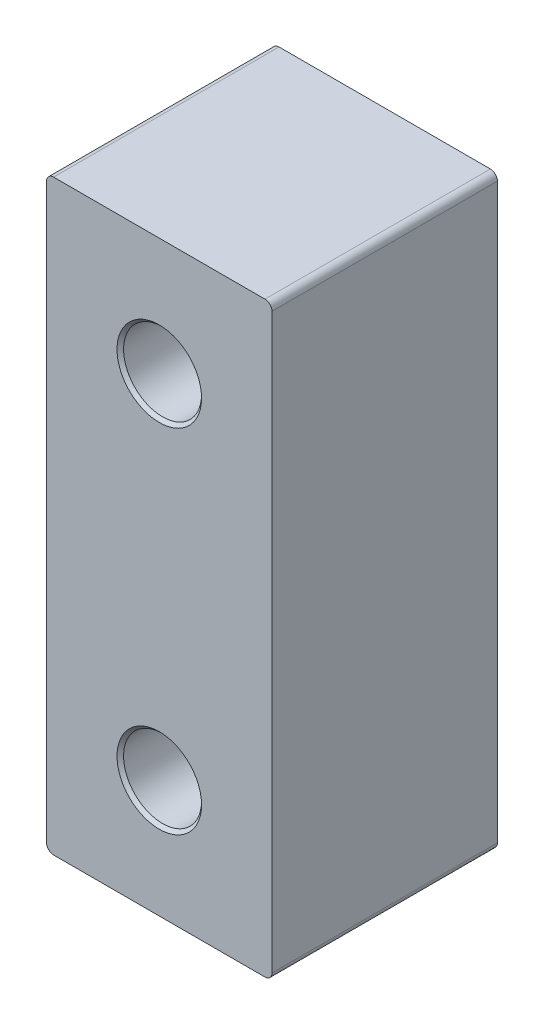
ISO-10303-21;
HEADER;
FILE_DESCRIPTION(('STEP AP214'),'2;1');
FILE_NAME('part.step','',(''),(''),'','','');
FILE_SCHEMA(('AUTOMOTIVE_DESIGN { 1 0 10303 214 1 1 1 1 }'));
ENDSEC;
DATA;
#1=APPLICATION_CONTEXT('core data for automotive mechanical design processes');
#2=APPLICATION_PROTOCOL_DEFINITION('international standard','automotive_design',2000,#1);
#3=PRODUCT_CONTEXT('',#1,'mechanical');
#4=PRODUCT('Part','Part','',(#3));
#5=PRODUCT_RELATED_PRODUCT_CATEGORY('part','',(#4));
#6=PRODUCT_DEFINITION_FORMATION('','',#4);
#7=PRODUCT_DEFINITION_CONTEXT('part definition',#1,'design');
#8=PRODUCT_DEFINITION('design','',#6,#7);
#9=PRODUCT_DEFINITION_SHAPE('','',#8);
#10=(LENGTH_UNIT() NAMED_UNIT(*) SI_UNIT(.MILLI.,.METRE.));
#11=(NAMED_UNIT(*) PLANE_ANGLE_UNIT() SI_UNIT($,.RADIAN.));
#12=(NAMED_UNIT(*) SI_UNIT($,.STERADIAN.) SOLID_ANGLE_UNIT());
#13=UNCERTAINTY_MEASURE_WITH_UNIT(LENGTH_MEASURE(1.E-05),#10,'distance_accuracy_value','');
#14=(GEOMETRIC_REPRESENTATION_CONTEXT(3) GLOBAL_UNCERTAINTY_ASSIGNED_CONTEXT((#13)) GLOBAL_UNIT_ASSIGNED_CONTEXT((#10,
#11,#12)) REPRESENTATION_CONTEXT('',''));
#15=CARTESIAN_POINT('',(0.,0.,0.));
#16=DIRECTION('',(0.,0.,1.));
#17=DIRECTION('',(1.,0.,0.));
#18=AXIS2_PLACEMENT_3D('',#15,#16,#17);
#19=CARTESIAN_POINT('',(-6.096,15.875,12.192));
#20=DIRECTION('',(1.,0.,0.));
#21=DIRECTION('',(0.,0.,-1.));
#22=AXIS2_PLACEMENT_3D('',#19,#20,#21);
#23=PLANE('',#22);
#24=DIRECTION('',(0.,-1.,0.));
#25=VECTOR('',#24,1.);
#26=CARTESIAN_POINT('',(-6.096,15.875,12.192));
#27=LINE('',#26,#25);
#28=CARTESIAN_POINT('',(-6.096,15.494,12.192));
#29=VERTEX_POINT('',#28);
#30=CARTESIAN_POINT('',(-6.096,-15.494,12.192));
#31=VERTEX_POINT('',#30);
#32=EDGE_CURVE('E120',#29,#31,#27,.T.);
#33=ORIENTED_EDGE('',*,*,#32,.F.);
#34=DIRECTION('',(0.,0.,-1.));
#35=VECTOR('',#34,1.);
#36=CARTESIAN_POINT('',(-6.096,15.494,12.192));
#37=LINE('',#36,#35);
#38=CARTESIAN_POINT('',(-6.096,15.494,0.));
#39=VERTEX_POINT('',#38);
#40=EDGE_CURVE('E105',#29,#39,#37,.T.);
#41=ORIENTED_EDGE('',*,*,#40,.T.);
#42=DIRECTION('',(0.,-1.,0.));
#43=VECTOR('',#42,1.);
#44=CARTESIAN_POINT('',(-6.096,15.875,0.));
#45=LINE('',#44,#43);
#46=CARTESIAN_POINT('',(-6.096,-15.494,0.));
#47=VERTEX_POINT('',#46);
#48=EDGE_CURVE('E117',#39,#47,#45,.T.);
#49=ORIENTED_EDGE('',*,*,#48,.T.);
#50=DIRECTION('',(0.,0.,-1.));
#51=VECTOR('',#50,1.);
#52=CARTESIAN_POINT('',(-6.096,-15.494,12.192));
#53=LINE('',#52,#51);
#54=EDGE_CURVE('E122',#47,#31,#53,.F.);
#55=ORIENTED_EDGE('',*,*,#54,.T.);
#56=EDGE_LOOP('',(#33,#41,#49,#55));
#57=FACE_BOUND('',#56,.T.);
#58=ADVANCED_FACE('F36',(#57),#23,.F.);
#59=CARTESIAN_POINT('',(-6.096,-15.875,12.192));
#60=DIRECTION('',(0.,1.,0.));
#61=DIRECTION('',(0.,0.,1.));
#62=AXIS2_PLACEMENT_3D('',#59,#60,#61);
#63=PLANE('',#62);
#64=DIRECTION('',(1.,0.,0.));
#65=VECTOR('',#64,1.);
#66=CARTESIAN_POINT('',(-6.096,-15.875,12.192));
#67=LINE('',#66,#65);
#68=CARTESIAN_POINT('',(-5.715,-15.875,12.192));
#69=VERTEX_POINT('',#68);
#70=CARTESIAN_POINT('',(5.715,-15.875,12.192));
#71=VERTEX_POINT('',#70);
#72=EDGE_CURVE('E178',#69,#71,#67,.T.);
#73=ORIENTED_EDGE('',*,*,#72,.F.);
#74=DIRECTION('',(0.,0.,-1.));
#75=VECTOR('',#74,1.);
#76=CARTESIAN_POINT('',(-5.715,-15.875,12.192));
#77=LINE('',#76,#75);
#78=CARTESIAN_POINT('',(-5.715,-15.875,0.));
#79=VERTEX_POINT('',#78);
#80=EDGE_CURVE('E159',#69,#79,#77,.T.);
#81=ORIENTED_EDGE('',*,*,#80,.T.);
#82=DIRECTION('',(1.,0.,0.));
#83=VECTOR('',#82,1.);
#84=CARTESIAN_POINT('',(-6.096,-15.875,0.));
#85=LINE('',#84,#83);
#86=CARTESIAN_POINT('',(5.715,-15.875,0.));
#87=VERTEX_POINT('',#86);
#88=EDGE_CURVE('E126',#79,#87,#85,.T.);
#89=ORIENTED_EDGE('',*,*,#88,.T.);
#90=DIRECTION('',(0.,0.,-1.));
#91=VECTOR('',#90,1.);
#92=CARTESIAN_POINT('',(5.71500000000001,-15.875,12.192));
#93=LINE('',#92,#91);
#94=EDGE_CURVE('E157',#87,#71,#93,.F.);
#95=ORIENTED_EDGE('',*,*,#94,.T.);
#96=EDGE_LOOP('',(#73,#81,#89,#95));
#97=FACE_BOUND('',#96,.T.);
#98=ADVANCED_FACE('F245',(#97),#63,.F.);
#99=CARTESIAN_POINT('',(6.096,15.875,12.192));
#100=DIRECTION('',(-1.,0.,0.));
#101=DIRECTION('',(0.,0.,1.));
#102=AXIS2_PLACEMENT_3D('',#99,#100,#101);
#103=PLANE('',#102);
#104=DIRECTION('',(0.,1.,0.));
#105=VECTOR('',#104,1.);
#106=CARTESIAN_POINT('',(6.096,15.875,0.));
#107=LINE('',#106,#105);
#108=CARTESIAN_POINT('',(6.096,-15.494,0.));
#109=VERTEX_POINT('',#108);
#110=CARTESIAN_POINT('',(6.096,15.494,0.));
#111=VERTEX_POINT('',#110);
#112=EDGE_CURVE('E130',#109,#111,#107,.T.);
#113=ORIENTED_EDGE('',*,*,#112,.T.);
#114=DIRECTION('',(0.,0.,-1.));
#115=VECTOR('',#114,1.);
#116=CARTESIAN_POINT('',(6.096,15.494,12.192));
#117=LINE('',#116,#115);
#118=CARTESIAN_POINT('',(6.096,15.494,12.192));
#119=VERTEX_POINT('',#118);
#120=EDGE_CURVE('E11',#111,#119,#117,.F.);
#121=ORIENTED_EDGE('',*,*,#120,.T.);
#122=DIRECTION('',(0.,1.,0.));
#123=VECTOR('',#122,1.);
#124=CARTESIAN_POINT('',(6.096,15.875,12.192));
#125=LINE('',#124,#123);
#126=CARTESIAN_POINT('',(6.096,-15.494,12.192));
#127=VERTEX_POINT('',#126);
#128=EDGE_CURVE('E165',#127,#119,#125,.T.);
#129=ORIENTED_EDGE('',*,*,#128,.F.);
#130=DIRECTION('',(0.,0.,-1.));
#131=VECTOR('',#130,1.);
#132=CARTESIAN_POINT('',(6.096,-15.494,12.192));
#133=LINE('',#132,#131);
#134=EDGE_CURVE('E44',#127,#109,#133,.T.);
#135=ORIENTED_EDGE('',*,*,#134,.T.);
#136=EDGE_LOOP('',(#113,#121,#129,#135));
#137=FACE_BOUND('',#136,.T.);
#138=ADVANCED_FACE('F164',(#137),#103,.F.);
#139=CARTESIAN_POINT('',(-6.096,15.875,12.192));
#140=DIRECTION('',(0.,-1.,0.));
#141=DIRECTION('',(0.,0.,-1.));
#142=AXIS2_PLACEMENT_3D('',#139,#140,#141);
#143=PLANE('',#142);
#144=DIRECTION('',(-1.,0.,0.));
#145=VECTOR('',#144,1.);
#146=CARTESIAN_POINT('',(-6.096,15.875,0.));
#147=LINE('',#146,#145);
#148=CARTESIAN_POINT('',(5.715,15.875,0.));
#149=VERTEX_POINT('',#148);
#150=CARTESIAN_POINT('',(-5.715,15.875,0.));
#151=VERTEX_POINT('',#150);
#152=EDGE_CURVE('E140',#149,#151,#147,.T.);
#153=ORIENTED_EDGE('',*,*,#152,.T.);
#154=DIRECTION('',(0.,0.,-1.));
#155=VECTOR('',#154,1.);
#156=CARTESIAN_POINT('',(-5.715,15.875,12.192));
#157=LINE('',#156,#155);
#158=CARTESIAN_POINT('',(-5.715,15.875,12.192));
#159=VERTEX_POINT('',#158);
#160=EDGE_CURVE('E106',#151,#159,#157,.F.);
#161=ORIENTED_EDGE('',*,*,#160,.T.);
#162=DIRECTION('',(-1.,0.,0.));
#163=VECTOR('',#162,1.);
#164=CARTESIAN_POINT('',(-6.096,15.875,12.192));
#165=LINE('',#164,#163);
#166=CARTESIAN_POINT('',(5.715,15.875,12.192));
#167=VERTEX_POINT('',#166);
#168=EDGE_CURVE('E136',#167,#159,#165,.T.);
#169=ORIENTED_EDGE('',*,*,#168,.F.);
#170=DIRECTION('',(0.,0.,-1.));
#171=VECTOR('',#170,1.);
#172=CARTESIAN_POINT('',(5.71500000000001,15.875,12.192));
#173=LINE('',#172,#171);
#174=EDGE_CURVE('E111',#167,#149,#173,.T.);
#175=ORIENTED_EDGE('',*,*,#174,.T.);
#176=EDGE_LOOP('',(#153,#161,#169,#175));
#177=FACE_BOUND('',#176,.T.);
#178=ADVANCED_FACE('F173',(#177),#143,.F.);
#179=CARTESIAN_POINT('',(0.,0.,12.192));
#180=DIRECTION('',(0.,0.,1.));
#181=DIRECTION('',(1.,0.,0.));
#182=AXIS2_PLACEMENT_3D('',#179,#180,#181);
#183=PLANE('',#182);
#184=CARTESIAN_POINT('',(0.,9.525,12.192));
#185=DIRECTION('',(0.,0.,1.));
#186=DIRECTION('',(1.,0.,0.));
#187=AXIS2_PLACEMENT_3D('',#184,#185,#186);
#188=CIRCLE('',#187,2.286);
#189=CARTESIAN_POINT('',(2.286,9.525,12.192));
#190=VERTEX_POINT('',#189);
#191=EDGE_CURVE('E198',#190,#190,#188,.T.);
#192=ORIENTED_EDGE('',*,*,#191,.F.);
#193=EDGE_LOOP('',(#192));
#194=FACE_BOUND('',#193,.T.);
#195=CARTESIAN_POINT('',(0.,-9.525,12.192));
#196=DIRECTION('',(0.,0.,1.));
#197=DIRECTION('',(1.,0.,0.));
#198=AXIS2_PLACEMENT_3D('',#195,#196,#197);
#199=CIRCLE('',#198,2.286);
#200=CARTESIAN_POINT('',(2.286,-9.525,12.192));
#201=VERTEX_POINT('',#200);
#202=EDGE_CURVE('E185',#201,#201,#199,.T.);
#203=ORIENTED_EDGE('',*,*,#202,.F.);
#204=EDGE_LOOP('',(#203));
#205=FACE_BOUND('',#204,.T.);
#206=ORIENTED_EDGE('',*,*,#168,.T.);
#207=CARTESIAN_POINT('',(-5.715,15.494,12.192));
#208=DIRECTION('',(0.,0.,1.));
#209=DIRECTION('',(1.,0.,0.));
#210=AXIS2_PLACEMENT_3D('',#207,#208,#209);
#211=CIRCLE('',#210,0.381);
#212=EDGE_CURVE('E155',#159,#29,#211,.T.);
#213=ORIENTED_EDGE('',*,*,#212,.T.);
#214=ORIENTED_EDGE('',*,*,#32,.T.);
#215=CARTESIAN_POINT('',(-5.715,-15.494,12.192));
#216=DIRECTION('',(0.,0.,1.));
#217=DIRECTION('',(1.,0.,0.));
#218=AXIS2_PLACEMENT_3D('',#215,#216,#217);
#219=CIRCLE('',#218,0.381);
#220=EDGE_CURVE('E153',#31,#69,#219,.T.);
#221=ORIENTED_EDGE('',*,*,#220,.T.);
#222=ORIENTED_EDGE('',*,*,#72,.T.);
#223=CARTESIAN_POINT('',(5.715,-15.494,12.192));
#224=DIRECTION('',(0.,0.,1.));
#225=DIRECTION('',(1.,0.,0.));
#226=AXIS2_PLACEMENT_3D('',#223,#224,#225);
#227=CIRCLE('',#226,0.381);
#228=EDGE_CURVE('E56',#71,#127,#227,.T.);
#229=ORIENTED_EDGE('',*,*,#228,.T.);
#230=ORIENTED_EDGE('',*,*,#128,.T.);
#231=CARTESIAN_POINT('',(5.71500000000001,15.494,12.192));
#232=DIRECTION('',(0.,0.,1.));
#233=DIRECTION('',(1.,0.,0.));
#234=AXIS2_PLACEMENT_3D('',#231,#232,#233);
#235=CIRCLE('',#234,0.381);
#236=EDGE_CURVE('E151',#119,#167,#235,.T.);
#237=ORIENTED_EDGE('',*,*,#236,.T.);
#238=EDGE_LOOP('',(#206,#213,#214,#221,#222,#229,#230,#237));
#239=FACE_BOUND('',#238,.T.);
#240=ADVANCED_FACE('F227',(#194,#205,#239),#183,.T.);
#241=CARTESIAN_POINT('',(0.,0.,0.));
#242=DIRECTION('',(0.,0.,1.));
#243=DIRECTION('',(1.,0.,0.));
#244=AXIS2_PLACEMENT_3D('',#241,#242,#243);
#245=PLANE('',#244);
#246=CARTESIAN_POINT('',(0.,9.525,0.));
#247=DIRECTION('',(0.,0.,1.));
#248=DIRECTION('',(1.,0.,0.));
#249=AXIS2_PLACEMENT_3D('',#246,#247,#248);
#250=CIRCLE('',#249,2.286);
#251=CARTESIAN_POINT('',(2.286,9.525,0.));
#252=VERTEX_POINT('',#251);
#253=EDGE_CURVE('E202',#252,#252,#250,.T.);
#254=ORIENTED_EDGE('',*,*,#253,.T.);
#255=EDGE_LOOP('',(#254));
#256=FACE_BOUND('',#255,.T.);
#257=CARTESIAN_POINT('',(0.,-9.525,0.));
#258=DIRECTION('',(0.,0.,1.));
#259=DIRECTION('',(1.,0.,0.));
#260=AXIS2_PLACEMENT_3D('',#257,#258,#259);
#261=CIRCLE('',#260,2.286);
#262=CARTESIAN_POINT('',(2.286,-9.525,0.));
#263=VERTEX_POINT('',#262);
#264=EDGE_CURVE('E189',#263,#263,#261,.T.);
#265=ORIENTED_EDGE('',*,*,#264,.T.);
#266=EDGE_LOOP('',(#265));
#267=FACE_BOUND('',#266,.T.);
#268=ORIENTED_EDGE('',*,*,#48,.F.);
#269=CARTESIAN_POINT('',(-5.715,15.494,0.));
#270=DIRECTION('',(0.,0.,1.));
#271=DIRECTION('',(1.,0.,0.));
#272=AXIS2_PLACEMENT_3D('',#269,#270,#271);
#273=CIRCLE('',#272,0.381);
#274=EDGE_CURVE('E101',#39,#151,#273,.F.);
#275=ORIENTED_EDGE('',*,*,#274,.T.);
#276=ORIENTED_EDGE('',*,*,#152,.F.);
#277=CARTESIAN_POINT('',(5.71500000000001,15.494,0.));
#278=DIRECTION('',(0.,0.,1.));
#279=DIRECTION('',(1.,0.,0.));
#280=AXIS2_PLACEMENT_3D('',#277,#278,#279);
#281=CIRCLE('',#280,0.381);
#282=EDGE_CURVE('E144',#149,#111,#281,.F.);
#283=ORIENTED_EDGE('',*,*,#282,.T.);
#284=ORIENTED_EDGE('',*,*,#112,.F.);
#285=CARTESIAN_POINT('',(5.715,-15.494,0.));
#286=DIRECTION('',(0.,0.,1.));
#287=DIRECTION('',(1.,0.,0.));
#288=AXIS2_PLACEMENT_3D('',#285,#286,#287);
#289=CIRCLE('',#288,0.381);
#290=EDGE_CURVE('E121',#109,#87,#289,.F.);
#291=ORIENTED_EDGE('',*,*,#290,.T.);
#292=ORIENTED_EDGE('',*,*,#88,.F.);
#293=CARTESIAN_POINT('',(-5.715,-15.494,0.));
#294=DIRECTION('',(0.,0.,1.));
#295=DIRECTION('',(1.,0.,0.));
#296=AXIS2_PLACEMENT_3D('',#293,#294,#295);
#297=CIRCLE('',#296,0.381);
#298=EDGE_CURVE('E112',#79,#47,#297,.F.);
#299=ORIENTED_EDGE('',*,*,#298,.T.);
#300=EDGE_LOOP('',(#268,#275,#276,#283,#284,#291,#292,#299));
#301=FACE_BOUND('',#300,.T.);
#302=ADVANCED_FACE('F124',(#256,#267,#301),#245,.F.);
#303=CARTESIAN_POINT('',(-5.715,15.494,12.192));
#304=DIRECTION('',(0.,0.,-1.));
#305=DIRECTION('',(-1.,0.,0.));
#306=AXIS2_PLACEMENT_3D('',#303,#304,#305);
#307=CYLINDRICAL_SURFACE('',#306,0.381);
#308=ORIENTED_EDGE('',*,*,#212,.F.);
#309=ORIENTED_EDGE('',*,*,#160,.F.);
#310=ORIENTED_EDGE('',*,*,#274,.F.);
#311=ORIENTED_EDGE('',*,*,#40,.F.);
#312=EDGE_LOOP('',(#308,#309,#310,#311));
#313=FACE_BOUND('',#312,.T.);
#314=ADVANCED_FACE('F104',(#313),#307,.T.);
#315=CARTESIAN_POINT('',(-5.715,-15.494,12.192));
#316=DIRECTION('',(0.,0.,-1.));
#317=DIRECTION('',(-1.,0.,0.));
#318=AXIS2_PLACEMENT_3D('',#315,#316,#317);
#319=CYLINDRICAL_SURFACE('',#318,0.381);
#320=ORIENTED_EDGE('',*,*,#220,.F.);
#321=ORIENTED_EDGE('',*,*,#54,.F.);
#322=ORIENTED_EDGE('',*,*,#298,.F.);
#323=ORIENTED_EDGE('',*,*,#80,.F.);
#324=EDGE_LOOP('',(#320,#321,#322,#323));
#325=FACE_BOUND('',#324,.T.);
#326=ADVANCED_FACE('F256',(#325),#319,.T.);
#327=CARTESIAN_POINT('',(5.71500000000001,15.494,12.192));
#328=DIRECTION('',(0.,0.,-1.));
#329=DIRECTION('',(-1.,0.,0.));
#330=AXIS2_PLACEMENT_3D('',#327,#328,#329);
#331=CYLINDRICAL_SURFACE('',#330,0.381);
#332=ORIENTED_EDGE('',*,*,#236,.F.);
#333=ORIENTED_EDGE('',*,*,#120,.F.);
#334=ORIENTED_EDGE('',*,*,#282,.F.);
#335=ORIENTED_EDGE('',*,*,#174,.F.);
#336=EDGE_LOOP('',(#332,#333,#334,#335));
#337=FACE_BOUND('',#336,.T.);
#338=ADVANCED_FACE('F170',(#337),#331,.T.);
#339=CARTESIAN_POINT('',(5.715,-15.494,12.192));
#340=DIRECTION('',(0.,0.,-1.));
#341=DIRECTION('',(-1.,0.,0.));
#342=AXIS2_PLACEMENT_3D('',#339,#340,#341);
#343=CYLINDRICAL_SURFACE('',#342,0.381);
#344=ORIENTED_EDGE('',*,*,#228,.F.);
#345=ORIENTED_EDGE('',*,*,#94,.F.);
#346=ORIENTED_EDGE('',*,*,#290,.F.);
#347=ORIENTED_EDGE('',*,*,#134,.F.);
#348=EDGE_LOOP('',(#344,#345,#346,#347));
#349=FACE_BOUND('',#348,.T.);
#350=ADVANCED_FACE('F38',(#349),#343,.T.);
#351=CARTESIAN_POINT('',(0.,-9.525,0.177800000000004));
#352=DIRECTION('',(0.,0.,-1.));
#353=DIRECTION('',(-1.,0.,0.));
#354=AXIS2_PLACEMENT_3D('',#351,#352,#353);
#355=CONICAL_SURFACE('',#354,2.1082,0.785398163397442);
#356=ORIENTED_EDGE('',*,*,#264,.F.);
#357=EDGE_LOOP('',(#356));
#358=FACE_BOUND('',#357,.T.);
#359=CARTESIAN_POINT('',(0.,-9.525,0.177800000000004));
#360=DIRECTION('',(0.,0.,1.));
#361=DIRECTION('',(1.,0.,0.));
#362=AXIS2_PLACEMENT_3D('',#359,#360,#361);
#363=CIRCLE('',#362,2.1082);
#364=CARTESIAN_POINT('',(2.1082,-9.525,0.177800000000004));
#365=VERTEX_POINT('',#364);
#366=EDGE_CURVE('E127',#365,#365,#363,.T.);
#367=ORIENTED_EDGE('',*,*,#366,.T.);
#368=EDGE_LOOP('',(#367));
#369=FACE_BOUND('',#368,.T.);
#370=ADVANCED_FACE('F240',(#358,#369),#355,.F.);
#371=CARTESIAN_POINT('',(0.,-9.525,12.192));
#372=DIRECTION('',(0.,0.,1.));
#373=DIRECTION('',(1.,0.,0.));
#374=AXIS2_PLACEMENT_3D('',#371,#372,#373);
#375=CYLINDRICAL_SURFACE('',#374,2.1082);
#376=ORIENTED_EDGE('',*,*,#366,.F.);
#377=EDGE_LOOP('',(#376));
#378=FACE_BOUND('',#377,.T.);
#379=CARTESIAN_POINT('',(0.,-9.525,12.0142));
#380=DIRECTION('',(0.,0.,1.));
#381=DIRECTION('',(1.,0.,0.));
#382=AXIS2_PLACEMENT_3D('',#379,#380,#381);
#383=CIRCLE('',#382,2.1082);
#384=CARTESIAN_POINT('',(2.1082,-9.525,12.0142));
#385=VERTEX_POINT('',#384);
#386=EDGE_CURVE('E133',#385,#385,#383,.T.);
#387=ORIENTED_EDGE('',*,*,#386,.T.);
#388=EDGE_LOOP('',(#387));
#389=FACE_BOUND('',#388,.T.);
#390=ADVANCED_FACE('F234',(#378,#389),#375,.F.);
#391=CARTESIAN_POINT('',(0.,-9.525,12.192));
#392=DIRECTION('',(0.,0.,1.));
#393=DIRECTION('',(1.,0.,0.));
#394=AXIS2_PLACEMENT_3D('',#391,#392,#393);
#395=CONICAL_SURFACE('',#394,2.286,0.785398163397443);
#396=ORIENTED_EDGE('',*,*,#386,.F.);
#397=EDGE_LOOP('',(#396));
#398=FACE_BOUND('',#397,.T.);
#399=ORIENTED_EDGE('',*,*,#202,.T.);
#400=EDGE_LOOP('',(#399));
#401=FACE_BOUND('',#400,.T.);
#402=ADVANCED_FACE('F212',(#398,#401),#395,.F.);
#403=CARTESIAN_POINT('',(0.,9.525,0.177800000000004));
#404=DIRECTION('',(0.,0.,-1.));
#405=DIRECTION('',(-1.,0.,0.));
#406=AXIS2_PLACEMENT_3D('',#403,#404,#405);
#407=CONICAL_SURFACE('',#406,2.1082,0.785398163397442);
#408=ORIENTED_EDGE('',*,*,#253,.F.);
#409=EDGE_LOOP('',(#408));
#410=FACE_BOUND('',#409,.T.);
#411=CARTESIAN_POINT('',(0.,9.525,0.177800000000004));
#412=DIRECTION('',(0.,0.,1.));
#413=DIRECTION('',(1.,0.,0.));
#414=AXIS2_PLACEMENT_3D('',#411,#412,#413);
#415=CIRCLE('',#414,2.1082);
#416=CARTESIAN_POINT('',(2.1082,9.525,0.177800000000004));
#417=VERTEX_POINT('',#416);
#418=EDGE_CURVE('E192',#417,#417,#415,.T.);
#419=ORIENTED_EDGE('',*,*,#418,.T.);
#420=EDGE_LOOP('',(#419));
#421=FACE_BOUND('',#420,.T.);
#422=ADVANCED_FACE('F208',(#410,#421),#407,.F.);
#423=CARTESIAN_POINT('',(0.,9.525,12.192));
#424=DIRECTION('',(0.,0.,1.));
#425=DIRECTION('',(1.,0.,0.));
#426=AXIS2_PLACEMENT_3D('',#423,#424,#425);
#427=CYLINDRICAL_SURFACE('',#426,2.1082);
#428=ORIENTED_EDGE('',*,*,#418,.F.);
#429=EDGE_LOOP('',(#428));
#430=FACE_BOUND('',#429,.T.);
#431=CARTESIAN_POINT('',(0.,9.525,12.0142));
#432=DIRECTION('',(0.,0.,1.));
#433=DIRECTION('',(1.,0.,0.));
#434=AXIS2_PLACEMENT_3D('',#431,#432,#433);
#435=CIRCLE('',#434,2.1082);
#436=CARTESIAN_POINT('',(2.1082,9.525,12.0142));
#437=VERTEX_POINT('',#436);
#438=EDGE_CURVE('E195',#437,#437,#435,.T.);
#439=ORIENTED_EDGE('',*,*,#438,.T.);
#440=EDGE_LOOP('',(#439));
#441=FACE_BOUND('',#440,.T.);
#442=ADVANCED_FACE('F211',(#430,#441),#427,.F.);
#443=CARTESIAN_POINT('',(0.,9.525,12.192));
#444=DIRECTION('',(0.,0.,1.));
#445=DIRECTION('',(1.,0.,0.));
#446=AXIS2_PLACEMENT_3D('',#443,#444,#445);
#447=CONICAL_SURFACE('',#446,2.286,0.785398163397443);
#448=ORIENTED_EDGE('',*,*,#438,.F.);
#449=EDGE_LOOP('',(#448));
#450=FACE_BOUND('',#449,.T.);
#451=ORIENTED_EDGE('',*,*,#191,.T.);
#452=EDGE_LOOP('',(#451));
#453=FACE_BOUND('',#452,.T.);
#454=ADVANCED_FACE('F218',(#450,#453),#447,.F.);
#455=CLOSED_SHELL('',(#58,#98,#138,#178,#240,#302,#314,#326,#338,#350,#370,#390,#402,#422,#442,#454));
#456=MANIFOLD_SOLID_BREP('B2',#455);
#457=ADVANCED_BREP_SHAPE_REPRESENTATION('',(#18,#456),#14);
#458=SHAPE_DEFINITION_REPRESENTATION(#9,#457);
ENDSEC;
END-ISO-10303-21;
